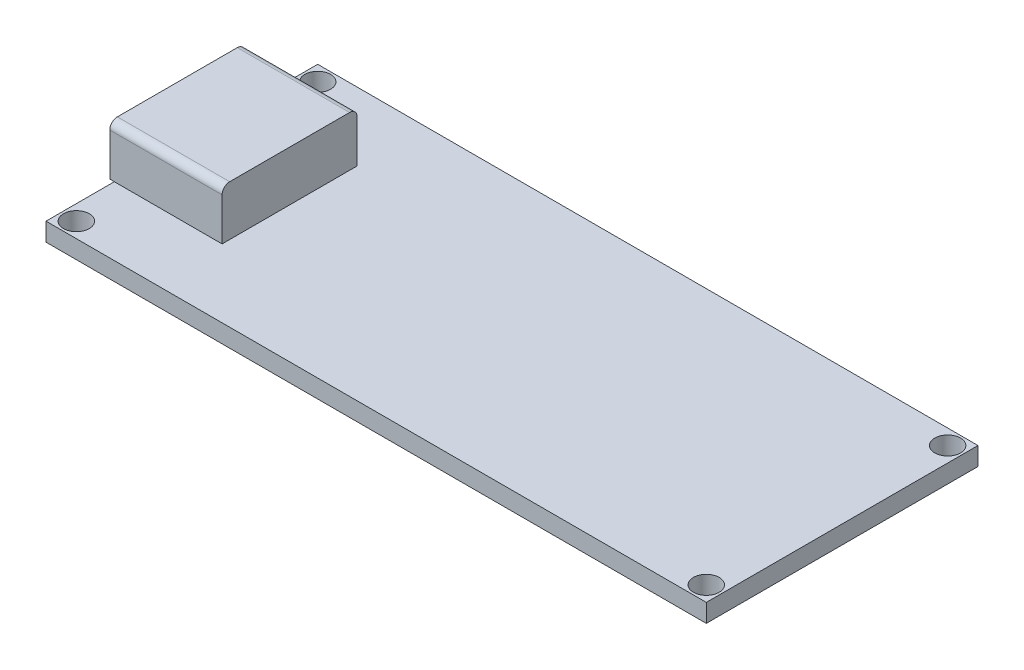
ISO-10303-21;
HEADER;
FILE_DESCRIPTION(('STEP AP214'),'2;1');
FILE_NAME('part.step','',(''),(''),'','','');
FILE_SCHEMA(('AUTOMOTIVE_DESIGN { 1 0 10303 214 1 1 1 1 }'));
ENDSEC;
DATA;
#1=APPLICATION_CONTEXT('core data for automotive mechanical design processes');
#2=APPLICATION_PROTOCOL_DEFINITION('international standard','automotive_design',2000,#1);
#3=PRODUCT_CONTEXT('',#1,'mechanical');
#4=PRODUCT('Part','Part','',(#3));
#5=PRODUCT_RELATED_PRODUCT_CATEGORY('part','',(#4));
#6=PRODUCT_DEFINITION_FORMATION('','',#4);
#7=PRODUCT_DEFINITION_CONTEXT('part definition',#1,'design');
#8=PRODUCT_DEFINITION('design','',#6,#7);
#9=PRODUCT_DEFINITION_SHAPE('','',#8);
#10=(LENGTH_UNIT() NAMED_UNIT(*) SI_UNIT(.MILLI.,.METRE.));
#11=(NAMED_UNIT(*) PLANE_ANGLE_UNIT() SI_UNIT($,.RADIAN.));
#12=(NAMED_UNIT(*) SI_UNIT($,.STERADIAN.) SOLID_ANGLE_UNIT());
#13=UNCERTAINTY_MEASURE_WITH_UNIT(LENGTH_MEASURE(1.E-05),#10,'distance_accuracy_value','');
#14=(GEOMETRIC_REPRESENTATION_CONTEXT(3) GLOBAL_UNCERTAINTY_ASSIGNED_CONTEXT((#13)) GLOBAL_UNIT_ASSIGNED_CONTEXT((#10,
#11,#12)) REPRESENTATION_CONTEXT('',''));
#15=CARTESIAN_POINT('',(0.,0.,0.));
#16=DIRECTION('',(0.,0.,1.));
#17=DIRECTION('',(1.,0.,0.));
#18=AXIS2_PLACEMENT_3D('',#15,#16,#17);
#19=CARTESIAN_POINT('',(0.,1.2,0.));
#20=DIRECTION('',(0.,-1.,0.));
#21=DIRECTION('',(0.,0.,-1.));
#22=AXIS2_PLACEMENT_3D('',#19,#20,#21);
#23=PLANE('',#22);
#24=CARTESIAN_POINT('',(-20.75,1.2,7.95));
#25=DIRECTION('',(0.,1.,0.));
#26=DIRECTION('',(0.,0.,1.));
#27=AXIS2_PLACEMENT_3D('',#24,#25,#26);
#28=CIRCLE('',#27,0.850000000000004);
#29=CARTESIAN_POINT('',(-20.75,1.2,8.80000000000001));
#30=VERTEX_POINT('',#29);
#31=EDGE_CURVE('E173',#30,#30,#28,.T.);
#32=ORIENTED_EDGE('',*,*,#31,.F.);
#33=EDGE_LOOP('',(#32));
#34=FACE_BOUND('',#33,.T.);
#35=CARTESIAN_POINT('',(20.75,1.2,-7.95));
#36=DIRECTION('',(0.,1.,0.));
#37=DIRECTION('',(0.,0.,1.));
#38=AXIS2_PLACEMENT_3D('',#35,#36,#37);
#39=CIRCLE('',#38,0.85);
#40=CARTESIAN_POINT('',(20.75,1.2,-7.1));
#41=VERTEX_POINT('',#40);
#42=EDGE_CURVE('E177',#41,#41,#39,.T.);
#43=ORIENTED_EDGE('',*,*,#42,.F.);
#44=EDGE_LOOP('',(#43));
#45=FACE_BOUND('',#44,.T.);
#46=CARTESIAN_POINT('',(20.75,1.2,7.95));
#47=DIRECTION('',(0.,1.,0.));
#48=DIRECTION('',(0.,0.,1.));
#49=AXIS2_PLACEMENT_3D('',#46,#47,#48);
#50=CIRCLE('',#49,0.85);
#51=CARTESIAN_POINT('',(20.75,1.2,8.8));
#52=VERTEX_POINT('',#51);
#53=EDGE_CURVE('E186',#52,#52,#50,.T.);
#54=ORIENTED_EDGE('',*,*,#53,.F.);
#55=EDGE_LOOP('',(#54));
#56=FACE_BOUND('',#55,.T.);
#57=CARTESIAN_POINT('',(-20.75,1.2,-7.95));
#58=DIRECTION('',(0.,1.,0.));
#59=DIRECTION('',(0.,0.,1.));
#60=AXIS2_PLACEMENT_3D('',#57,#58,#59);
#61=CIRCLE('',#60,0.85);
#62=CARTESIAN_POINT('',(-20.75,1.2,-7.1));
#63=VERTEX_POINT('',#62);
#64=EDGE_CURVE('E191',#63,#63,#61,.T.);
#65=ORIENTED_EDGE('',*,*,#64,.F.);
#66=EDGE_LOOP('',(#65));
#67=FACE_BOUND('',#66,.T.);
#68=DIRECTION('',(-1.,0.,0.));
#69=VECTOR('',#68,1.);
#70=CARTESIAN_POINT('',(-22.05,1.2,-4.45));
#71=LINE('',#70,#69);
#72=CARTESIAN_POINT('',(-14.65,1.2,-4.45));
#73=VERTEX_POINT('',#72);
#74=CARTESIAN_POINT('',(-21.75,1.2,-4.45));
#75=VERTEX_POINT('',#74);
#76=EDGE_CURVE('E167',#73,#75,#71,.T.);
#77=ORIENTED_EDGE('',*,*,#76,.F.);
#78=DIRECTION('',(0.,0.,-1.));
#79=VECTOR('',#78,1.);
#80=CARTESIAN_POINT('',(-14.65,1.2,-4.45));
#81=LINE('',#80,#79);
#82=CARTESIAN_POINT('',(-14.65,1.2,4.45));
#83=VERTEX_POINT('',#82);
#84=EDGE_CURVE('E151',#83,#73,#81,.T.);
#85=ORIENTED_EDGE('',*,*,#84,.F.);
#86=DIRECTION('',(1.,0.,0.));
#87=VECTOR('',#86,1.);
#88=CARTESIAN_POINT('',(-22.05,1.2,4.45));
#89=LINE('',#88,#87);
#90=CARTESIAN_POINT('',(-21.75,1.2,4.45));
#91=VERTEX_POINT('',#90);
#92=EDGE_CURVE('E153',#91,#83,#89,.T.);
#93=ORIENTED_EDGE('',*,*,#92,.F.);
#94=DIRECTION('',(0.,0.,1.));
#95=VECTOR('',#94,1.);
#96=CARTESIAN_POINT('',(-21.75,1.2,8.95));
#97=LINE('',#96,#95);
#98=CARTESIAN_POINT('',(-21.75,1.2,8.95));
#99=VERTEX_POINT('',#98);
#100=EDGE_CURVE('E205',#91,#99,#97,.T.);
#101=ORIENTED_EDGE('',*,*,#100,.T.);
#102=DIRECTION('',(1.,0.,0.));
#103=VECTOR('',#102,1.);
#104=CARTESIAN_POINT('',(-21.75,1.2,8.95));
#105=LINE('',#104,#103);
#106=CARTESIAN_POINT('',(21.75,1.2,8.95));
#107=VERTEX_POINT('',#106);
#108=EDGE_CURVE('E203',#99,#107,#105,.T.);
#109=ORIENTED_EDGE('',*,*,#108,.T.);
#110=DIRECTION('',(0.,0.,-1.));
#111=VECTOR('',#110,1.);
#112=CARTESIAN_POINT('',(21.75,1.2,8.95));
#113=LINE('',#112,#111);
#114=CARTESIAN_POINT('',(21.75,1.2,-8.95));
#115=VERTEX_POINT('',#114);
#116=EDGE_CURVE('E204',#107,#115,#113,.T.);
#117=ORIENTED_EDGE('',*,*,#116,.T.);
#118=DIRECTION('',(-1.,0.,0.));
#119=VECTOR('',#118,1.);
#120=CARTESIAN_POINT('',(-21.75,1.2,-8.95));
#121=LINE('',#120,#119);
#122=CARTESIAN_POINT('',(-21.75,1.2,-8.95));
#123=VERTEX_POINT('',#122);
#124=EDGE_CURVE('E206',#115,#123,#121,.T.);
#125=ORIENTED_EDGE('',*,*,#124,.T.);
#126=EDGE_CURVE('E196',#123,#75,#97,.T.);
#127=ORIENTED_EDGE('',*,*,#126,.T.);
#128=EDGE_LOOP('',(#77,#85,#93,#101,#109,#117,#125,#127));
#129=FACE_BOUND('',#128,.T.);
#130=ADVANCED_FACE('F47',(#34,#45,#56,#67,#129),#23,.F.);
#131=CARTESIAN_POINT('',(0.,0.,0.));
#132=DIRECTION('',(0.,-1.,0.));
#133=DIRECTION('',(0.,0.,-1.));
#134=AXIS2_PLACEMENT_3D('',#131,#132,#133);
#135=PLANE('',#134);
#136=CARTESIAN_POINT('',(20.75,0.,-7.95));
#137=DIRECTION('',(0.,1.,0.));
#138=DIRECTION('',(0.,0.,1.));
#139=AXIS2_PLACEMENT_3D('',#136,#137,#138);
#140=CIRCLE('',#139,0.85);
#141=CARTESIAN_POINT('',(20.75,0.,-7.1));
#142=VERTEX_POINT('',#141);
#143=EDGE_CURVE('E176',#142,#142,#140,.T.);
#144=ORIENTED_EDGE('',*,*,#143,.T.);
#145=EDGE_LOOP('',(#144));
#146=FACE_BOUND('',#145,.T.);
#147=CARTESIAN_POINT('',(-20.75,0.,-7.95));
#148=DIRECTION('',(0.,1.,0.));
#149=DIRECTION('',(0.,0.,1.));
#150=AXIS2_PLACEMENT_3D('',#147,#148,#149);
#151=CIRCLE('',#150,0.85);
#152=CARTESIAN_POINT('',(-20.75,0.,-7.1));
#153=VERTEX_POINT('',#152);
#154=EDGE_CURVE('E188',#153,#153,#151,.T.);
#155=ORIENTED_EDGE('',*,*,#154,.T.);
#156=EDGE_LOOP('',(#155));
#157=FACE_BOUND('',#156,.T.);
#158=DIRECTION('',(0.,0.,1.));
#159=VECTOR('',#158,1.);
#160=CARTESIAN_POINT('',(-21.75,0.,8.95));
#161=LINE('',#160,#159);
#162=CARTESIAN_POINT('',(-21.75,0.,-8.95));
#163=VERTEX_POINT('',#162);
#164=CARTESIAN_POINT('',(-21.75,0.,8.95));
#165=VERTEX_POINT('',#164);
#166=EDGE_CURVE('E192',#163,#165,#161,.T.);
#167=ORIENTED_EDGE('',*,*,#166,.F.);
#168=DIRECTION('',(-1.,0.,0.));
#169=VECTOR('',#168,1.);
#170=CARTESIAN_POINT('',(-21.75,0.,-8.95));
#171=LINE('',#170,#169);
#172=CARTESIAN_POINT('',(21.75,0.,-8.95));
#173=VERTEX_POINT('',#172);
#174=EDGE_CURVE('E214',#173,#163,#171,.T.);
#175=ORIENTED_EDGE('',*,*,#174,.F.);
#176=DIRECTION('',(0.,0.,-1.));
#177=VECTOR('',#176,1.);
#178=CARTESIAN_POINT('',(21.75,0.,8.95));
#179=LINE('',#178,#177);
#180=CARTESIAN_POINT('',(21.75,0.,8.95));
#181=VERTEX_POINT('',#180);
#182=EDGE_CURVE('E213',#181,#173,#179,.T.);
#183=ORIENTED_EDGE('',*,*,#182,.F.);
#184=DIRECTION('',(1.,0.,0.));
#185=VECTOR('',#184,1.);
#186=CARTESIAN_POINT('',(-21.75,0.,8.95));
#187=LINE('',#186,#185);
#188=EDGE_CURVE('E211',#165,#181,#187,.T.);
#189=ORIENTED_EDGE('',*,*,#188,.F.);
#190=EDGE_LOOP('',(#167,#175,#183,#189));
#191=FACE_BOUND('',#190,.T.);
#192=CARTESIAN_POINT('',(20.75,0.,7.95));
#193=DIRECTION('',(0.,1.,0.));
#194=DIRECTION('',(0.,0.,1.));
#195=AXIS2_PLACEMENT_3D('',#192,#193,#194);
#196=CIRCLE('',#195,0.85);
#197=CARTESIAN_POINT('',(20.75,0.,8.8));
#198=VERTEX_POINT('',#197);
#199=EDGE_CURVE('E181',#198,#198,#196,.T.);
#200=ORIENTED_EDGE('',*,*,#199,.T.);
#201=EDGE_LOOP('',(#200));
#202=FACE_BOUND('',#201,.T.);
#203=CARTESIAN_POINT('',(-20.75,0.,7.95));
#204=DIRECTION('',(0.,1.,0.));
#205=DIRECTION('',(0.,0.,1.));
#206=AXIS2_PLACEMENT_3D('',#203,#204,#205);
#207=CIRCLE('',#206,0.850000000000004);
#208=CARTESIAN_POINT('',(-20.75,0.,8.80000000000001));
#209=VERTEX_POINT('',#208);
#210=EDGE_CURVE('E143',#209,#209,#207,.T.);
#211=ORIENTED_EDGE('',*,*,#210,.T.);
#212=EDGE_LOOP('',(#211));
#213=FACE_BOUND('',#212,.T.);
#214=ADVANCED_FACE('F257',(#146,#157,#191,#202,#213),#135,.T.);
#215=CARTESIAN_POINT('',(-21.75,1.2,8.95));
#216=DIRECTION('',(1.,0.,0.));
#217=DIRECTION('',(0.,0.,-1.));
#218=AXIS2_PLACEMENT_3D('',#215,#216,#217);
#219=PLANE('',#218);
#220=ORIENTED_EDGE('',*,*,#166,.T.);
#221=DIRECTION('',(0.,-1.,0.));
#222=VECTOR('',#221,1.);
#223=CARTESIAN_POINT('',(-21.75,1.2,8.95));
#224=LINE('',#223,#222);
#225=EDGE_CURVE('E223',#99,#165,#224,.T.);
#226=ORIENTED_EDGE('',*,*,#225,.F.);
#227=ORIENTED_EDGE('',*,*,#100,.F.);
#228=EDGE_CURVE('E147',#75,#91,#97,.T.);
#229=ORIENTED_EDGE('',*,*,#228,.F.);
#230=ORIENTED_EDGE('',*,*,#126,.F.);
#231=DIRECTION('',(0.,-1.,0.));
#232=VECTOR('',#231,1.);
#233=CARTESIAN_POINT('',(-21.75,1.2,-8.95));
#234=LINE('',#233,#232);
#235=EDGE_CURVE('E208',#123,#163,#234,.T.);
#236=ORIENTED_EDGE('',*,*,#235,.T.);
#237=EDGE_LOOP('',(#220,#226,#227,#229,#230,#236));
#238=FACE_BOUND('',#237,.T.);
#239=ADVANCED_FACE('F266',(#238),#219,.F.);
#240=CARTESIAN_POINT('',(-21.75,1.2,8.95));
#241=DIRECTION('',(0.,0.,-1.));
#242=DIRECTION('',(-1.,0.,0.));
#243=AXIS2_PLACEMENT_3D('',#240,#241,#242);
#244=PLANE('',#243);
#245=ORIENTED_EDGE('',*,*,#188,.T.);
#246=DIRECTION('',(0.,-1.,0.));
#247=VECTOR('',#246,1.);
#248=CARTESIAN_POINT('',(21.75,1.2,8.95));
#249=LINE('',#248,#247);
#250=EDGE_CURVE('E225',#107,#181,#249,.T.);
#251=ORIENTED_EDGE('',*,*,#250,.F.);
#252=ORIENTED_EDGE('',*,*,#108,.F.);
#253=ORIENTED_EDGE('',*,*,#225,.T.);
#254=EDGE_LOOP('',(#245,#251,#252,#253));
#255=FACE_BOUND('',#254,.T.);
#256=ADVANCED_FACE('F285',(#255),#244,.F.);
#257=CARTESIAN_POINT('',(21.75,1.2,8.95));
#258=DIRECTION('',(-1.,0.,0.));
#259=DIRECTION('',(0.,0.,1.));
#260=AXIS2_PLACEMENT_3D('',#257,#258,#259);
#261=PLANE('',#260);
#262=ORIENTED_EDGE('',*,*,#182,.T.);
#263=DIRECTION('',(0.,-1.,0.));
#264=VECTOR('',#263,1.);
#265=CARTESIAN_POINT('',(21.75,1.2,-8.95));
#266=LINE('',#265,#264);
#267=EDGE_CURVE('E218',#115,#173,#266,.T.);
#268=ORIENTED_EDGE('',*,*,#267,.F.);
#269=ORIENTED_EDGE('',*,*,#116,.F.);
#270=ORIENTED_EDGE('',*,*,#250,.T.);
#271=EDGE_LOOP('',(#262,#268,#269,#270));
#272=FACE_BOUND('',#271,.T.);
#273=ADVANCED_FACE('F279',(#272),#261,.F.);
#274=CARTESIAN_POINT('',(-21.75,1.2,-8.95));
#275=DIRECTION('',(0.,0.,1.));
#276=DIRECTION('',(1.,0.,0.));
#277=AXIS2_PLACEMENT_3D('',#274,#275,#276);
#278=PLANE('',#277);
#279=ORIENTED_EDGE('',*,*,#174,.T.);
#280=ORIENTED_EDGE('',*,*,#235,.F.);
#281=ORIENTED_EDGE('',*,*,#124,.F.);
#282=ORIENTED_EDGE('',*,*,#267,.T.);
#283=EDGE_LOOP('',(#279,#280,#281,#282));
#284=FACE_BOUND('',#283,.T.);
#285=ADVANCED_FACE('F274',(#284),#278,.F.);
#286=CARTESIAN_POINT('',(-20.75,1.2,-7.95));
#287=DIRECTION('',(0.,-1.,0.));
#288=DIRECTION('',(0.,0.,-1.));
#289=AXIS2_PLACEMENT_3D('',#286,#287,#288);
#290=CYLINDRICAL_SURFACE('',#289,0.85);
#291=ORIENTED_EDGE('',*,*,#64,.T.);
#292=EDGE_LOOP('',(#291));
#293=FACE_BOUND('',#292,.T.);
#294=ORIENTED_EDGE('',*,*,#154,.F.);
#295=EDGE_LOOP('',(#294));
#296=FACE_BOUND('',#295,.T.);
#297=ADVANCED_FACE('F275',(#293,#296),#290,.F.);
#298=CARTESIAN_POINT('',(20.75,1.2,7.95));
#299=DIRECTION('',(0.,-1.,0.));
#300=DIRECTION('',(0.,0.,-1.));
#301=AXIS2_PLACEMENT_3D('',#298,#299,#300);
#302=CYLINDRICAL_SURFACE('',#301,0.85);
#303=ORIENTED_EDGE('',*,*,#53,.T.);
#304=EDGE_LOOP('',(#303));
#305=FACE_BOUND('',#304,.T.);
#306=ORIENTED_EDGE('',*,*,#199,.F.);
#307=EDGE_LOOP('',(#306));
#308=FACE_BOUND('',#307,.T.);
#309=ADVANCED_FACE('F317',(#305,#308),#302,.F.);
#310=CARTESIAN_POINT('',(20.75,1.2,-7.95));
#311=DIRECTION('',(0.,-1.,0.));
#312=DIRECTION('',(0.,0.,-1.));
#313=AXIS2_PLACEMENT_3D('',#310,#311,#312);
#314=CYLINDRICAL_SURFACE('',#313,0.85);
#315=ORIENTED_EDGE('',*,*,#42,.T.);
#316=EDGE_LOOP('',(#315));
#317=FACE_BOUND('',#316,.T.);
#318=ORIENTED_EDGE('',*,*,#143,.F.);
#319=EDGE_LOOP('',(#318));
#320=FACE_BOUND('',#319,.T.);
#321=ADVANCED_FACE('F315',(#317,#320),#314,.F.);
#322=CARTESIAN_POINT('',(-20.75,1.2,7.95));
#323=DIRECTION('',(0.,-1.,0.));
#324=DIRECTION('',(0.,0.,-1.));
#325=AXIS2_PLACEMENT_3D('',#322,#323,#324);
#326=CYLINDRICAL_SURFACE('',#325,0.850000000000004);
#327=ORIENTED_EDGE('',*,*,#31,.T.);
#328=EDGE_LOOP('',(#327));
#329=FACE_BOUND('',#328,.T.);
#330=ORIENTED_EDGE('',*,*,#210,.F.);
#331=EDGE_LOOP('',(#330));
#332=FACE_BOUND('',#331,.T.);
#333=ADVANCED_FACE('F309',(#329,#332),#326,.F.);
#334=CARTESIAN_POINT('',(0.,1.2,0.));
#335=DIRECTION('',(0.,1.,0.));
#336=DIRECTION('',(0.,0.,1.));
#337=AXIS2_PLACEMENT_3D('',#334,#335,#336);
#338=PLANE('',#337);
#339=CARTESIAN_POINT('',(-22.05,1.2,-4.45));
#340=VERTEX_POINT('',#339);
#341=EDGE_CURVE('E164',#75,#340,#71,.T.);
#342=ORIENTED_EDGE('',*,*,#341,.F.);
#343=ORIENTED_EDGE('',*,*,#228,.T.);
#344=CARTESIAN_POINT('',(-22.05,1.2,4.45));
#345=VERTEX_POINT('',#344);
#346=EDGE_CURVE('E139',#345,#91,#89,.T.);
#347=ORIENTED_EDGE('',*,*,#346,.F.);
#348=DIRECTION('',(0.,0.,1.));
#349=VECTOR('',#348,1.);
#350=CARTESIAN_POINT('',(-22.05,1.2,-4.45));
#351=LINE('',#350,#349);
#352=EDGE_CURVE('E149',#340,#345,#351,.T.);
#353=ORIENTED_EDGE('',*,*,#352,.F.);
#354=EDGE_LOOP('',(#342,#343,#347,#353));
#355=FACE_BOUND('',#354,.T.);
#356=ADVANCED_FACE('F146',(#355),#338,.F.);
#357=CARTESIAN_POINT('',(-22.05,4.5,-4.45));
#358=DIRECTION('',(1.,0.,0.));
#359=DIRECTION('',(0.,0.,-1.));
#360=AXIS2_PLACEMENT_3D('',#357,#358,#359);
#361=PLANE('',#360);
#362=DIRECTION('',(0.,0.,1.));
#363=VECTOR('',#362,1.);
#364=CARTESIAN_POINT('',(-22.05,4.5,-4.45));
#365=LINE('',#364,#363);
#366=CARTESIAN_POINT('',(-22.05,4.5,-3.95));
#367=VERTEX_POINT('',#366);
#368=CARTESIAN_POINT('',(-22.05,4.5,3.95));
#369=VERTEX_POINT('',#368);
#370=EDGE_CURVE('E166',#367,#369,#365,.T.);
#371=ORIENTED_EDGE('',*,*,#370,.F.);
#372=CARTESIAN_POINT('',(-22.05,4.,-3.95));
#373=DIRECTION('',(1.,0.,0.));
#374=DIRECTION('',(0.,0.,-1.));
#375=AXIS2_PLACEMENT_3D('',#372,#373,#374);
#376=CIRCLE('',#375,0.5);
#377=CARTESIAN_POINT('',(-22.05,4.,-4.45));
#378=VERTEX_POINT('',#377);
#379=EDGE_CURVE('E237',#367,#378,#376,.F.);
#380=ORIENTED_EDGE('',*,*,#379,.T.);
#381=DIRECTION('',(0.,-1.,0.));
#382=VECTOR('',#381,1.);
#383=CARTESIAN_POINT('',(-22.05,4.5,-4.45));
#384=LINE('',#383,#382);
#385=EDGE_CURVE('E156',#378,#340,#384,.T.);
#386=ORIENTED_EDGE('',*,*,#385,.T.);
#387=ORIENTED_EDGE('',*,*,#352,.T.);
#388=DIRECTION('',(0.,-1.,0.));
#389=VECTOR('',#388,1.);
#390=CARTESIAN_POINT('',(-22.05,4.5,4.45));
#391=LINE('',#390,#389);
#392=CARTESIAN_POINT('',(-22.05,4.,4.45));
#393=VERTEX_POINT('',#392);
#394=EDGE_CURVE('E135',#393,#345,#391,.T.);
#395=ORIENTED_EDGE('',*,*,#394,.F.);
#396=CARTESIAN_POINT('',(-22.05,4.,3.95));
#397=DIRECTION('',(1.,0.,0.));
#398=DIRECTION('',(0.,0.,-1.));
#399=AXIS2_PLACEMENT_3D('',#396,#397,#398);
#400=CIRCLE('',#399,0.5);
#401=EDGE_CURVE('E233',#393,#369,#400,.F.);
#402=ORIENTED_EDGE('',*,*,#401,.T.);
#403=EDGE_LOOP('',(#371,#380,#386,#387,#395,#402));
#404=FACE_BOUND('',#403,.T.);
#405=ADVANCED_FACE('F154',(#404),#361,.F.);
#406=CARTESIAN_POINT('',(-22.05,4.5,4.45));
#407=DIRECTION('',(0.,0.,-1.));
#408=DIRECTION('',(-1.,0.,0.));
#409=AXIS2_PLACEMENT_3D('',#406,#407,#408);
#410=PLANE('',#409);
#411=DIRECTION('',(0.,-1.,0.));
#412=VECTOR('',#411,1.);
#413=CARTESIAN_POINT('',(-14.65,4.5,4.45));
#414=LINE('',#413,#412);
#415=CARTESIAN_POINT('',(-14.65,4.,4.45));
#416=VERTEX_POINT('',#415);
#417=EDGE_CURVE('E142',#416,#83,#414,.T.);
#418=ORIENTED_EDGE('',*,*,#417,.F.);
#419=DIRECTION('',(1.,0.,0.));
#420=VECTOR('',#419,1.);
#421=CARTESIAN_POINT('',(-22.05,4.,4.45));
#422=LINE('',#421,#420);
#423=EDGE_CURVE('E11',#416,#393,#422,.F.);
#424=ORIENTED_EDGE('',*,*,#423,.T.);
#425=ORIENTED_EDGE('',*,*,#394,.T.);
#426=ORIENTED_EDGE('',*,*,#346,.T.);
#427=ORIENTED_EDGE('',*,*,#92,.T.);
#428=EDGE_LOOP('',(#418,#424,#425,#426,#427));
#429=FACE_BOUND('',#428,.T.);
#430=ADVANCED_FACE('F133',(#429),#410,.F.);
#431=CARTESIAN_POINT('',(-14.65,4.5,-4.45));
#432=DIRECTION('',(-1.,0.,0.));
#433=DIRECTION('',(0.,0.,1.));
#434=AXIS2_PLACEMENT_3D('',#431,#432,#433);
#435=PLANE('',#434);
#436=DIRECTION('',(0.,-1.,0.));
#437=VECTOR('',#436,1.);
#438=CARTESIAN_POINT('',(-14.65,4.5,-4.45));
#439=LINE('',#438,#437);
#440=CARTESIAN_POINT('',(-14.65,4.,-4.45));
#441=VERTEX_POINT('',#440);
#442=EDGE_CURVE('E171',#441,#73,#439,.T.);
#443=ORIENTED_EDGE('',*,*,#442,.F.);
#444=CARTESIAN_POINT('',(-14.65,4.,-3.95));
#445=DIRECTION('',(-1.,0.,0.));
#446=DIRECTION('',(0.,0.,1.));
#447=AXIS2_PLACEMENT_3D('',#444,#445,#446);
#448=CIRCLE('',#447,0.5);
#449=CARTESIAN_POINT('',(-14.65,4.5,-3.95));
#450=VERTEX_POINT('',#449);
#451=EDGE_CURVE('E60',#441,#450,#448,.F.);
#452=ORIENTED_EDGE('',*,*,#451,.T.);
#453=DIRECTION('',(0.,0.,-1.));
#454=VECTOR('',#453,1.);
#455=CARTESIAN_POINT('',(-14.65,4.5,-4.45));
#456=LINE('',#455,#454);
#457=CARTESIAN_POINT('',(-14.65,4.5,3.95));
#458=VERTEX_POINT('',#457);
#459=EDGE_CURVE('E159',#458,#450,#456,.T.);
#460=ORIENTED_EDGE('',*,*,#459,.F.);
#461=CARTESIAN_POINT('',(-14.65,4.,3.95));
#462=DIRECTION('',(-1.,0.,0.));
#463=DIRECTION('',(0.,0.,1.));
#464=AXIS2_PLACEMENT_3D('',#461,#462,#463);
#465=CIRCLE('',#464,0.5);
#466=EDGE_CURVE('E63',#458,#416,#465,.F.);
#467=ORIENTED_EDGE('',*,*,#466,.T.);
#468=ORIENTED_EDGE('',*,*,#417,.T.);
#469=ORIENTED_EDGE('',*,*,#84,.T.);
#470=EDGE_LOOP('',(#443,#452,#460,#467,#468,#469));
#471=FACE_BOUND('',#470,.T.);
#472=ADVANCED_FACE('F241',(#471),#435,.F.);
#473=CARTESIAN_POINT('',(-22.05,4.5,-4.45));
#474=DIRECTION('',(0.,0.,1.));
#475=DIRECTION('',(1.,0.,0.));
#476=AXIS2_PLACEMENT_3D('',#473,#474,#475);
#477=PLANE('',#476);
#478=ORIENTED_EDGE('',*,*,#385,.F.);
#479=DIRECTION('',(-1.,0.,0.));
#480=VECTOR('',#479,1.);
#481=CARTESIAN_POINT('',(-14.65,4.,-4.45));
#482=LINE('',#481,#480);
#483=EDGE_CURVE('E75',#378,#441,#482,.F.);
#484=ORIENTED_EDGE('',*,*,#483,.T.);
#485=ORIENTED_EDGE('',*,*,#442,.T.);
#486=ORIENTED_EDGE('',*,*,#76,.T.);
#487=ORIENTED_EDGE('',*,*,#341,.T.);
#488=EDGE_LOOP('',(#478,#484,#485,#486,#487));
#489=FACE_BOUND('',#488,.T.);
#490=ADVANCED_FACE('F248',(#489),#477,.F.);
#491=CARTESIAN_POINT('',(0.,4.5,0.));
#492=DIRECTION('',(0.,1.,0.));
#493=DIRECTION('',(0.,0.,1.));
#494=AXIS2_PLACEMENT_3D('',#491,#492,#493);
#495=PLANE('',#494);
#496=ORIENTED_EDGE('',*,*,#459,.T.);
#497=DIRECTION('',(-1.,0.,0.));
#498=VECTOR('',#497,1.);
#499=CARTESIAN_POINT('',(-22.05,4.5,-3.95));
#500=LINE('',#499,#498);
#501=EDGE_CURVE('E234',#450,#367,#500,.T.);
#502=ORIENTED_EDGE('',*,*,#501,.T.);
#503=ORIENTED_EDGE('',*,*,#370,.T.);
#504=DIRECTION('',(1.,0.,0.));
#505=VECTOR('',#504,1.);
#506=CARTESIAN_POINT('',(-14.65,4.5,3.95));
#507=LINE('',#506,#505);
#508=EDGE_CURVE('E227',#369,#458,#507,.T.);
#509=ORIENTED_EDGE('',*,*,#508,.T.);
#510=EDGE_LOOP('',(#496,#502,#503,#509));
#511=FACE_BOUND('',#510,.T.);
#512=ADVANCED_FACE('F244',(#511),#495,.T.);
#513=CARTESIAN_POINT('',(0.,4.,-3.95000000000001));
#514=DIRECTION('',(1.,0.,0.));
#515=DIRECTION('',(0.,0.,-1.));
#516=AXIS2_PLACEMENT_3D('',#513,#514,#515);
#517=CYLINDRICAL_SURFACE('',#516,0.5);
#518=ORIENTED_EDGE('',*,*,#451,.F.);
#519=ORIENTED_EDGE('',*,*,#483,.F.);
#520=ORIENTED_EDGE('',*,*,#379,.F.);
#521=ORIENTED_EDGE('',*,*,#501,.F.);
#522=EDGE_LOOP('',(#518,#519,#520,#521));
#523=FACE_BOUND('',#522,.T.);
#524=ADVANCED_FACE('F250',(#523),#517,.T.);
#525=CARTESIAN_POINT('',(0.,4.,3.95));
#526=DIRECTION('',(-1.,0.,0.));
#527=DIRECTION('',(0.,0.,1.));
#528=AXIS2_PLACEMENT_3D('',#525,#526,#527);
#529=CYLINDRICAL_SURFACE('',#528,0.5);
#530=ORIENTED_EDGE('',*,*,#401,.F.);
#531=ORIENTED_EDGE('',*,*,#423,.F.);
#532=ORIENTED_EDGE('',*,*,#466,.F.);
#533=ORIENTED_EDGE('',*,*,#508,.F.);
#534=EDGE_LOOP('',(#530,#531,#532,#533));
#535=FACE_BOUND('',#534,.T.);
#536=ADVANCED_FACE('F51',(#535),#529,.T.);
#537=CLOSED_SHELL('',(#130,#214,#239,#256,#273,#285,#297,#309,#321,#333,#356,#405,#430,#472,
#490,#512,#524,#536));
#538=MANIFOLD_SOLID_BREP('B2',#537);
#539=ADVANCED_BREP_SHAPE_REPRESENTATION('',(#18,#538),#14);
#540=SHAPE_DEFINITION_REPRESENTATION(#9,#539);
ENDSEC;
END-ISO-10303-21;
